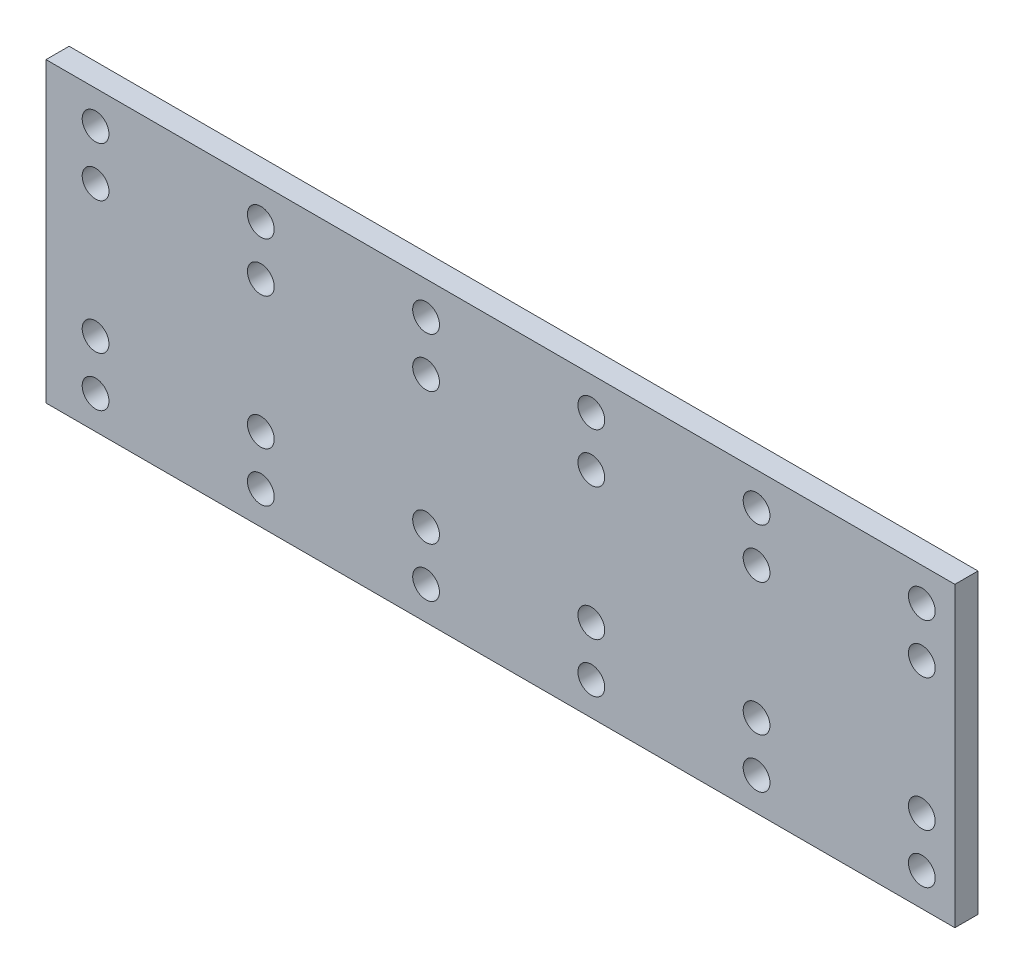
ISO-10303-21;
HEADER;
FILE_DESCRIPTION(('STEP AP214'),'2;1');
FILE_NAME('part.step','',(''),(''),'','','');
FILE_SCHEMA(('AUTOMOTIVE_DESIGN { 1 0 10303 214 1 1 1 1 }'));
ENDSEC;
DATA;
#1=APPLICATION_CONTEXT('core data for automotive mechanical design processes');
#2=APPLICATION_PROTOCOL_DEFINITION('international standard','automotive_design',2000,#1);
#3=PRODUCT_CONTEXT('',#1,'mechanical');
#4=PRODUCT('Part','Part','',(#3));
#5=PRODUCT_RELATED_PRODUCT_CATEGORY('part','',(#4));
#6=PRODUCT_DEFINITION_FORMATION('','',#4);
#7=PRODUCT_DEFINITION_CONTEXT('part definition',#1,'design');
#8=PRODUCT_DEFINITION('design','',#6,#7);
#9=PRODUCT_DEFINITION_SHAPE('','',#8);
#10=(LENGTH_UNIT() NAMED_UNIT(*) SI_UNIT(.MILLI.,.METRE.));
#11=(NAMED_UNIT(*) PLANE_ANGLE_UNIT() SI_UNIT($,.RADIAN.));
#12=(NAMED_UNIT(*) SI_UNIT($,.STERADIAN.) SOLID_ANGLE_UNIT());
#13=UNCERTAINTY_MEASURE_WITH_UNIT(LENGTH_MEASURE(1.E-05),#10,'distance_accuracy_value','');
#14=(GEOMETRIC_REPRESENTATION_CONTEXT(3) GLOBAL_UNCERTAINTY_ASSIGNED_CONTEXT((#13)) GLOBAL_UNIT_ASSIGNED_CONTEXT((#10,
#11,#12)) REPRESENTATION_CONTEXT('',''));
#15=CARTESIAN_POINT('',(0.,0.,0.));
#16=DIRECTION('',(0.,0.,1.));
#17=DIRECTION('',(1.,0.,0.));
#18=AXIS2_PLACEMENT_3D('',#15,#16,#17);
#19=CARTESIAN_POINT('',(0.,0.,7.));
#20=DIRECTION('',(1.,0.,0.));
#21=DIRECTION('',(0.,0.,-1.));
#22=AXIS2_PLACEMENT_3D('',#19,#20,#21);
#23=PLANE('',#22);
#24=DIRECTION('',(0.,-1.,0.));
#25=VECTOR('',#24,1.);
#26=CARTESIAN_POINT('',(0.,0.,0.));
#27=LINE('',#26,#25);
#28=CARTESIAN_POINT('',(0.,90.,0.));
#29=VERTEX_POINT('',#28);
#30=CARTESIAN_POINT('',(0.,0.,0.));
#31=VERTEX_POINT('',#30);
#32=EDGE_CURVE('E112',#29,#31,#27,.T.);
#33=ORIENTED_EDGE('',*,*,#32,.T.);
#34=DIRECTION('',(0.,0.,-1.));
#35=VECTOR('',#34,1.);
#36=CARTESIAN_POINT('',(0.,0.,7.));
#37=LINE('',#36,#35);
#38=CARTESIAN_POINT('',(0.,0.,7.));
#39=VERTEX_POINT('',#38);
#40=EDGE_CURVE('E13',#39,#31,#37,.T.);
#41=ORIENTED_EDGE('',*,*,#40,.F.);
#42=DIRECTION('',(0.,-1.,0.));
#43=VECTOR('',#42,1.);
#44=CARTESIAN_POINT('',(0.,0.,7.));
#45=LINE('',#44,#43);
#46=CARTESIAN_POINT('',(0.,90.,7.));
#47=VERTEX_POINT('',#46);
#48=EDGE_CURVE('E99',#47,#39,#45,.T.);
#49=ORIENTED_EDGE('',*,*,#48,.F.);
#50=DIRECTION('',(0.,0.,-1.));
#51=VECTOR('',#50,1.);
#52=CARTESIAN_POINT('',(0.,90.,7.));
#53=LINE('',#52,#51);
#54=EDGE_CURVE('E108',#47,#29,#53,.T.);
#55=ORIENTED_EDGE('',*,*,#54,.T.);
#56=EDGE_LOOP('',(#33,#41,#49,#55));
#57=FACE_BOUND('',#56,.T.);
#58=ADVANCED_FACE('F46',(#57),#23,.F.);
#59=CARTESIAN_POINT('',(0.,0.,7.));
#60=DIRECTION('',(0.,1.,0.));
#61=DIRECTION('',(0.,0.,1.));
#62=AXIS2_PLACEMENT_3D('',#59,#60,#61);
#63=PLANE('',#62);
#64=DIRECTION('',(1.,0.,0.));
#65=VECTOR('',#64,1.);
#66=CARTESIAN_POINT('',(0.,0.,0.));
#67=LINE('',#66,#65);
#68=CARTESIAN_POINT('',(275.,0.,0.));
#69=VERTEX_POINT('',#68);
#70=EDGE_CURVE('E103',#31,#69,#67,.T.);
#71=ORIENTED_EDGE('',*,*,#70,.T.);
#72=DIRECTION('',(0.,0.,-1.));
#73=VECTOR('',#72,1.);
#74=CARTESIAN_POINT('',(275.,0.,7.));
#75=LINE('',#74,#73);
#76=CARTESIAN_POINT('',(275.,0.,7.));
#77=VERTEX_POINT('',#76);
#78=EDGE_CURVE('E55',#77,#69,#75,.T.);
#79=ORIENTED_EDGE('',*,*,#78,.F.);
#80=DIRECTION('',(1.,0.,0.));
#81=VECTOR('',#80,1.);
#82=CARTESIAN_POINT('',(0.,0.,7.));
#83=LINE('',#82,#81);
#84=EDGE_CURVE('E94',#39,#77,#83,.T.);
#85=ORIENTED_EDGE('',*,*,#84,.F.);
#86=ORIENTED_EDGE('',*,*,#40,.T.);
#87=EDGE_LOOP('',(#71,#79,#85,#86));
#88=FACE_BOUND('',#87,.T.);
#89=ADVANCED_FACE('F102',(#88),#63,.F.);
#90=CARTESIAN_POINT('',(275.,0.,7.));
#91=DIRECTION('',(-1.,0.,0.));
#92=DIRECTION('',(0.,0.,1.));
#93=AXIS2_PLACEMENT_3D('',#90,#91,#92);
#94=PLANE('',#93);
#95=DIRECTION('',(0.,1.,0.));
#96=VECTOR('',#95,1.);
#97=CARTESIAN_POINT('',(275.,0.,0.));
#98=LINE('',#97,#96);
#99=CARTESIAN_POINT('',(275.,90.,0.));
#100=VERTEX_POINT('',#99);
#101=EDGE_CURVE('E81',#69,#100,#98,.T.);
#102=ORIENTED_EDGE('',*,*,#101,.T.);
#103=DIRECTION('',(0.,0.,-1.));
#104=VECTOR('',#103,1.);
#105=CARTESIAN_POINT('',(275.,90.,7.));
#106=LINE('',#105,#104);
#107=CARTESIAN_POINT('',(275.,90.,7.));
#108=VERTEX_POINT('',#107);
#109=EDGE_CURVE('E104',#108,#100,#106,.T.);
#110=ORIENTED_EDGE('',*,*,#109,.F.);
#111=DIRECTION('',(0.,1.,0.));
#112=VECTOR('',#111,1.);
#113=CARTESIAN_POINT('',(275.,0.,7.));
#114=LINE('',#113,#112);
#115=EDGE_CURVE('E97',#77,#108,#114,.T.);
#116=ORIENTED_EDGE('',*,*,#115,.F.);
#117=ORIENTED_EDGE('',*,*,#78,.T.);
#118=EDGE_LOOP('',(#102,#110,#116,#117));
#119=FACE_BOUND('',#118,.T.);
#120=ADVANCED_FACE('F106',(#119),#94,.F.);
#121=CARTESIAN_POINT('',(0.,90.,7.));
#122=DIRECTION('',(0.,-1.,0.));
#123=DIRECTION('',(0.,0.,-1.));
#124=AXIS2_PLACEMENT_3D('',#121,#122,#123);
#125=PLANE('',#124);
#126=DIRECTION('',(-1.,0.,0.));
#127=VECTOR('',#126,1.);
#128=CARTESIAN_POINT('',(0.,90.,0.));
#129=LINE('',#128,#127);
#130=EDGE_CURVE('E87',#100,#29,#129,.T.);
#131=ORIENTED_EDGE('',*,*,#130,.T.);
#132=ORIENTED_EDGE('',*,*,#54,.F.);
#133=DIRECTION('',(-1.,0.,0.));
#134=VECTOR('',#133,1.);
#135=CARTESIAN_POINT('',(0.,90.,7.));
#136=LINE('',#135,#134);
#137=EDGE_CURVE('E64',#108,#47,#136,.T.);
#138=ORIENTED_EDGE('',*,*,#137,.F.);
#139=ORIENTED_EDGE('',*,*,#109,.T.);
#140=EDGE_LOOP('',(#131,#132,#138,#139));
#141=FACE_BOUND('',#140,.T.);
#142=ADVANCED_FACE('F273',(#141),#125,.F.);
#143=CARTESIAN_POINT('',(0.,0.,7.));
#144=DIRECTION('',(0.,0.,-1.));
#145=DIRECTION('',(-1.,0.,0.));
#146=AXIS2_PLACEMENT_3D('',#143,#144,#145);
#147=PLANE('',#146);
#148=CARTESIAN_POINT('',(165.,9.99999999999928,7.));
#149=DIRECTION('',(0.,0.,1.));
#150=DIRECTION('',(1.,0.,0.));
#151=AXIS2_PLACEMENT_3D('',#148,#149,#150);
#152=CIRCLE('',#151,4.04999999999999);
#153=CARTESIAN_POINT('',(169.05,9.99999999999928,7.));
#154=VERTEX_POINT('',#153);
#155=EDGE_CURVE('E246',#154,#154,#152,.T.);
#156=ORIENTED_EDGE('',*,*,#155,.F.);
#157=EDGE_LOOP('',(#156));
#158=FACE_BOUND('',#157,.T.);
#159=CARTESIAN_POINT('',(165.,24.9999999999993,7.));
#160=DIRECTION('',(0.,0.,1.));
#161=DIRECTION('',(1.,0.,0.));
#162=AXIS2_PLACEMENT_3D('',#159,#160,#161);
#163=CIRCLE('',#162,4.04999999999999);
#164=CARTESIAN_POINT('',(169.05,24.9999999999993,7.));
#165=VERTEX_POINT('',#164);
#166=EDGE_CURVE('E262',#165,#165,#163,.T.);
#167=ORIENTED_EDGE('',*,*,#166,.F.);
#168=EDGE_LOOP('',(#167));
#169=FACE_BOUND('',#168,.T.);
#170=CARTESIAN_POINT('',(215.,24.9999999999996,7.));
#171=DIRECTION('',(0.,0.,1.));
#172=DIRECTION('',(1.,0.,0.));
#173=AXIS2_PLACEMENT_3D('',#170,#171,#172);
#174=CIRCLE('',#173,4.04999999999996);
#175=CARTESIAN_POINT('',(219.05,24.9999999999996,7.));
#176=VERTEX_POINT('',#175);
#177=EDGE_CURVE('E257',#176,#176,#174,.T.);
#178=ORIENTED_EDGE('',*,*,#177,.F.);
#179=EDGE_LOOP('',(#178));
#180=FACE_BOUND('',#179,.T.);
#181=CARTESIAN_POINT('',(215.,9.99999999999963,7.));
#182=DIRECTION('',(0.,0.,1.));
#183=DIRECTION('',(1.,0.,0.));
#184=AXIS2_PLACEMENT_3D('',#181,#182,#183);
#185=CIRCLE('',#184,4.04999999999996);
#186=CARTESIAN_POINT('',(219.05,9.99999999999963,7.));
#187=VERTEX_POINT('',#186);
#188=EDGE_CURVE('E254',#187,#187,#185,.T.);
#189=ORIENTED_EDGE('',*,*,#188,.F.);
#190=EDGE_LOOP('',(#189));
#191=FACE_BOUND('',#190,.T.);
#192=CARTESIAN_POINT('',(265.,25.,7.));
#193=DIRECTION('',(0.,0.,1.));
#194=DIRECTION('',(1.,0.,0.));
#195=AXIS2_PLACEMENT_3D('',#192,#193,#194);
#196=CIRCLE('',#195,4.05000000000002);
#197=CARTESIAN_POINT('',(269.05,25.,7.));
#198=VERTEX_POINT('',#197);
#199=EDGE_CURVE('E128',#198,#198,#196,.T.);
#200=ORIENTED_EDGE('',*,*,#199,.F.);
#201=EDGE_LOOP('',(#200));
#202=FACE_BOUND('',#201,.T.);
#203=CARTESIAN_POINT('',(265.,80.,7.));
#204=DIRECTION('',(0.,0.,1.));
#205=DIRECTION('',(1.,0.,0.));
#206=AXIS2_PLACEMENT_3D('',#203,#204,#205);
#207=CIRCLE('',#206,4.05000000000002);
#208=CARTESIAN_POINT('',(269.05,80.,7.));
#209=VERTEX_POINT('',#208);
#210=EDGE_CURVE('E202',#209,#209,#207,.T.);
#211=ORIENTED_EDGE('',*,*,#210,.F.);
#212=EDGE_LOOP('',(#211));
#213=FACE_BOUND('',#212,.T.);
#214=CARTESIAN_POINT('',(265.,65.,7.));
#215=DIRECTION('',(0.,0.,1.));
#216=DIRECTION('',(1.,0.,0.));
#217=AXIS2_PLACEMENT_3D('',#214,#215,#216);
#218=CIRCLE('',#217,4.05000000000002);
#219=CARTESIAN_POINT('',(269.05,65.,7.));
#220=VERTEX_POINT('',#219);
#221=EDGE_CURVE('E249',#220,#220,#218,.T.);
#222=ORIENTED_EDGE('',*,*,#221,.F.);
#223=EDGE_LOOP('',(#222));
#224=FACE_BOUND('',#223,.T.);
#225=CARTESIAN_POINT('',(215.,64.9999999999996,7.));
#226=DIRECTION('',(0.,0.,1.));
#227=DIRECTION('',(1.,0.,0.));
#228=AXIS2_PLACEMENT_3D('',#225,#226,#227);
#229=CIRCLE('',#228,4.04999999999996);
#230=CARTESIAN_POINT('',(219.05,64.9999999999996,7.));
#231=VERTEX_POINT('',#230);
#232=EDGE_CURVE('E240',#231,#231,#229,.T.);
#233=ORIENTED_EDGE('',*,*,#232,.F.);
#234=EDGE_LOOP('',(#233));
#235=FACE_BOUND('',#234,.T.);
#236=CARTESIAN_POINT('',(215.,79.9999999999996,7.));
#237=DIRECTION('',(0.,0.,1.));
#238=DIRECTION('',(1.,0.,0.));
#239=AXIS2_PLACEMENT_3D('',#236,#237,#238);
#240=CIRCLE('',#239,4.04999999999996);
#241=CARTESIAN_POINT('',(219.05,79.9999999999996,7.));
#242=VERTEX_POINT('',#241);
#243=EDGE_CURVE('E236',#242,#242,#240,.T.);
#244=ORIENTED_EDGE('',*,*,#243,.F.);
#245=EDGE_LOOP('',(#244));
#246=FACE_BOUND('',#245,.T.);
#247=CARTESIAN_POINT('',(165.,79.9999999999993,7.));
#248=DIRECTION('',(0.,0.,1.));
#249=DIRECTION('',(1.,0.,0.));
#250=AXIS2_PLACEMENT_3D('',#247,#248,#249);
#251=CIRCLE('',#250,4.04999999999999);
#252=CARTESIAN_POINT('',(169.05,79.9999999999993,7.));
#253=VERTEX_POINT('',#252);
#254=EDGE_CURVE('E239',#253,#253,#251,.T.);
#255=ORIENTED_EDGE('',*,*,#254,.F.);
#256=EDGE_LOOP('',(#255));
#257=FACE_BOUND('',#256,.T.);
#258=CARTESIAN_POINT('',(165.,64.9999999999993,7.));
#259=DIRECTION('',(0.,0.,1.));
#260=DIRECTION('',(1.,0.,0.));
#261=AXIS2_PLACEMENT_3D('',#258,#259,#260);
#262=CIRCLE('',#261,4.04999999999999);
#263=CARTESIAN_POINT('',(169.05,64.9999999999993,7.));
#264=VERTEX_POINT('',#263);
#265=EDGE_CURVE('E243',#264,#264,#262,.T.);
#266=ORIENTED_EDGE('',*,*,#265,.F.);
#267=EDGE_LOOP('',(#266));
#268=FACE_BOUND('',#267,.T.);
#269=CARTESIAN_POINT('',(65.0000000000001,9.99999999999858,7.));
#270=DIRECTION('',(0.,0.,1.));
#271=DIRECTION('',(1.,0.,0.));
#272=AXIS2_PLACEMENT_3D('',#269,#270,#271);
#273=CIRCLE('',#272,4.05);
#274=CARTESIAN_POINT('',(69.0500000000001,9.99999999999858,7.));
#275=VERTEX_POINT('',#274);
#276=EDGE_CURVE('E214',#275,#275,#273,.T.);
#277=ORIENTED_EDGE('',*,*,#276,.F.);
#278=EDGE_LOOP('',(#277));
#279=FACE_BOUND('',#278,.T.);
#280=CARTESIAN_POINT('',(65.0000000000001,24.9999999999986,7.));
#281=DIRECTION('',(0.,0.,1.));
#282=DIRECTION('',(1.,0.,0.));
#283=AXIS2_PLACEMENT_3D('',#280,#281,#282);
#284=CIRCLE('',#283,4.05);
#285=CARTESIAN_POINT('',(69.0500000000001,24.9999999999986,7.));
#286=VERTEX_POINT('',#285);
#287=EDGE_CURVE('E222',#286,#286,#284,.T.);
#288=ORIENTED_EDGE('',*,*,#287,.F.);
#289=EDGE_LOOP('',(#288));
#290=FACE_BOUND('',#289,.T.);
#291=CARTESIAN_POINT('',(15.0000000000001,79.9999999999982,7.));
#292=DIRECTION('',(0.,0.,1.));
#293=DIRECTION('',(1.,0.,0.));
#294=AXIS2_PLACEMENT_3D('',#291,#292,#293);
#295=CIRCLE('',#294,4.05);
#296=CARTESIAN_POINT('',(19.0500000000001,79.9999999999982,7.));
#297=VERTEX_POINT('',#296);
#298=EDGE_CURVE('E219',#297,#297,#295,.T.);
#299=ORIENTED_EDGE('',*,*,#298,.F.);
#300=EDGE_LOOP('',(#299));
#301=FACE_BOUND('',#300,.T.);
#302=CARTESIAN_POINT('',(15.0000000000001,64.9999999999982,7.));
#303=DIRECTION('',(0.,0.,1.));
#304=DIRECTION('',(1.,0.,0.));
#305=AXIS2_PLACEMENT_3D('',#302,#303,#304);
#306=CIRCLE('',#305,4.05);
#307=CARTESIAN_POINT('',(19.0500000000001,64.9999999999982,7.));
#308=VERTEX_POINT('',#307);
#309=EDGE_CURVE('E223',#308,#308,#306,.T.);
#310=ORIENTED_EDGE('',*,*,#309,.F.);
#311=EDGE_LOOP('',(#310));
#312=FACE_BOUND('',#311,.T.);
#313=CARTESIAN_POINT('',(15.0000000000001,24.9999999999982,7.));
#314=DIRECTION('',(0.,0.,1.));
#315=DIRECTION('',(1.,0.,0.));
#316=AXIS2_PLACEMENT_3D('',#313,#314,#315);
#317=CIRCLE('',#316,4.05);
#318=CARTESIAN_POINT('',(19.0500000000001,24.9999999999982,7.));
#319=VERTEX_POINT('',#318);
#320=EDGE_CURVE('E231',#319,#319,#317,.T.);
#321=ORIENTED_EDGE('',*,*,#320,.F.);
#322=EDGE_LOOP('',(#321));
#323=FACE_BOUND('',#322,.T.);
#324=CARTESIAN_POINT('',(15.0000000000001,9.99999999999824,7.));
#325=DIRECTION('',(0.,0.,1.));
#326=DIRECTION('',(1.,0.,0.));
#327=AXIS2_PLACEMENT_3D('',#324,#325,#326);
#328=CIRCLE('',#327,4.05);
#329=CARTESIAN_POINT('',(19.0500000000001,9.99999999999824,7.));
#330=VERTEX_POINT('',#329);
#331=EDGE_CURVE('E228',#330,#330,#328,.T.);
#332=ORIENTED_EDGE('',*,*,#331,.F.);
#333=EDGE_LOOP('',(#332));
#334=FACE_BOUND('',#333,.T.);
#335=CARTESIAN_POINT('',(115.,24.9999999999989,7.));
#336=DIRECTION('',(0.,0.,1.));
#337=DIRECTION('',(1.,0.,0.));
#338=AXIS2_PLACEMENT_3D('',#335,#336,#337);
#339=CIRCLE('',#338,4.04999999999999);
#340=CARTESIAN_POINT('',(119.05,24.9999999999989,7.));
#341=VERTEX_POINT('',#340);
#342=EDGE_CURVE('E204',#341,#341,#339,.T.);
#343=ORIENTED_EDGE('',*,*,#342,.F.);
#344=EDGE_LOOP('',(#343));
#345=FACE_BOUND('',#344,.T.);
#346=CARTESIAN_POINT('',(115.,79.9999999999989,7.));
#347=DIRECTION('',(0.,0.,1.));
#348=DIRECTION('',(1.,0.,0.));
#349=AXIS2_PLACEMENT_3D('',#346,#347,#348);
#350=CIRCLE('',#349,4.04999999999999);
#351=CARTESIAN_POINT('',(119.05,79.9999999999989,7.));
#352=VERTEX_POINT('',#351);
#353=EDGE_CURVE('E203',#352,#352,#350,.T.);
#354=ORIENTED_EDGE('',*,*,#353,.F.);
#355=EDGE_LOOP('',(#354));
#356=FACE_BOUND('',#355,.T.);
#357=CARTESIAN_POINT('',(115.,64.9999999999989,7.));
#358=DIRECTION('',(0.,0.,1.));
#359=DIRECTION('',(1.,0.,0.));
#360=AXIS2_PLACEMENT_3D('',#357,#358,#359);
#361=CIRCLE('',#360,4.04999999999999);
#362=CARTESIAN_POINT('',(119.05,64.9999999999989,7.));
#363=VERTEX_POINT('',#362);
#364=EDGE_CURVE('E199',#363,#363,#361,.T.);
#365=ORIENTED_EDGE('',*,*,#364,.F.);
#366=EDGE_LOOP('',(#365));
#367=FACE_BOUND('',#366,.T.);
#368=CARTESIAN_POINT('',(115.,9.99999999999893,7.));
#369=DIRECTION('',(0.,0.,1.));
#370=DIRECTION('',(1.,0.,0.));
#371=AXIS2_PLACEMENT_3D('',#368,#369,#370);
#372=CIRCLE('',#371,4.04999999999999);
#373=CARTESIAN_POINT('',(119.05,9.99999999999893,7.));
#374=VERTEX_POINT('',#373);
#375=EDGE_CURVE('E207',#374,#374,#372,.T.);
#376=ORIENTED_EDGE('',*,*,#375,.F.);
#377=EDGE_LOOP('',(#376));
#378=FACE_BOUND('',#377,.T.);
#379=CARTESIAN_POINT('',(65.0000000000001,64.9999999999986,7.));
#380=DIRECTION('',(0.,0.,1.));
#381=DIRECTION('',(1.,0.,0.));
#382=AXIS2_PLACEMENT_3D('',#379,#380,#381);
#383=CIRCLE('',#382,4.05);
#384=CARTESIAN_POINT('',(69.0500000000001,64.9999999999986,7.));
#385=VERTEX_POINT('',#384);
#386=EDGE_CURVE('E213',#385,#385,#383,.T.);
#387=ORIENTED_EDGE('',*,*,#386,.F.);
#388=EDGE_LOOP('',(#387));
#389=FACE_BOUND('',#388,.T.);
#390=CARTESIAN_POINT('',(65.0000000000001,79.9999999999986,7.));
#391=DIRECTION('',(0.,0.,1.));
#392=DIRECTION('',(1.,0.,0.));
#393=AXIS2_PLACEMENT_3D('',#390,#391,#392);
#394=CIRCLE('',#393,4.05);
#395=CARTESIAN_POINT('',(69.0500000000001,79.9999999999986,7.));
#396=VERTEX_POINT('',#395);
#397=EDGE_CURVE('E210',#396,#396,#394,.T.);
#398=ORIENTED_EDGE('',*,*,#397,.F.);
#399=EDGE_LOOP('',(#398));
#400=FACE_BOUND('',#399,.T.);
#401=CARTESIAN_POINT('',(265.,9.99999999999998,7.));
#402=DIRECTION('',(0.,0.,1.));
#403=DIRECTION('',(1.,0.,0.));
#404=AXIS2_PLACEMENT_3D('',#401,#402,#403);
#405=CIRCLE('',#404,4.05000000000002);
#406=CARTESIAN_POINT('',(269.05,9.99999999999998,7.));
#407=VERTEX_POINT('',#406);
#408=EDGE_CURVE('E123',#407,#407,#405,.T.);
#409=ORIENTED_EDGE('',*,*,#408,.F.);
#410=EDGE_LOOP('',(#409));
#411=FACE_BOUND('',#410,.T.);
#412=ORIENTED_EDGE('',*,*,#48,.T.);
#413=ORIENTED_EDGE('',*,*,#84,.T.);
#414=ORIENTED_EDGE('',*,*,#115,.T.);
#415=ORIENTED_EDGE('',*,*,#137,.T.);
#416=EDGE_LOOP('',(#412,#413,#414,#415));
#417=FACE_BOUND('',#416,.T.);
#418=ADVANCED_FACE('F95',(#158,#169,#180,#191,#202,#213,#224,#235,#246,#257,#268,#279,#290,#301,
#312,#323,#334,#345,#356,#367,#378,#389,#400,#411,#417),#147,.F.);
#419=CARTESIAN_POINT('',(0.,0.,0.));
#420=DIRECTION('',(0.,0.,-1.));
#421=DIRECTION('',(-1.,0.,0.));
#422=AXIS2_PLACEMENT_3D('',#419,#420,#421);
#423=PLANE('',#422);
#424=CARTESIAN_POINT('',(165.,9.99999999999928,0.));
#425=DIRECTION('',(0.,0.,-1.));
#426=DIRECTION('',(-1.,0.,0.));
#427=AXIS2_PLACEMENT_3D('',#424,#425,#426);
#428=CIRCLE('',#427,4.04999999999999);
#429=CARTESIAN_POINT('',(160.95,9.99999999999928,0.));
#430=VERTEX_POINT('',#429);
#431=EDGE_CURVE('E49',#430,#430,#428,.T.);
#432=ORIENTED_EDGE('',*,*,#431,.F.);
#433=EDGE_LOOP('',(#432));
#434=FACE_BOUND('',#433,.T.);
#435=CARTESIAN_POINT('',(165.,24.9999999999993,0.));
#436=DIRECTION('',(0.,0.,-1.));
#437=DIRECTION('',(-1.,0.,0.));
#438=AXIS2_PLACEMENT_3D('',#435,#436,#437);
#439=CIRCLE('',#438,4.04999999999999);
#440=CARTESIAN_POINT('',(160.95,24.9999999999993,0.));
#441=VERTEX_POINT('',#440);
#442=EDGE_CURVE('E187',#441,#441,#439,.T.);
#443=ORIENTED_EDGE('',*,*,#442,.F.);
#444=EDGE_LOOP('',(#443));
#445=FACE_BOUND('',#444,.T.);
#446=CARTESIAN_POINT('',(215.,24.9999999999996,0.));
#447=DIRECTION('',(0.,0.,-1.));
#448=DIRECTION('',(-1.,0.,0.));
#449=AXIS2_PLACEMENT_3D('',#446,#447,#448);
#450=CIRCLE('',#449,4.04999999999996);
#451=CARTESIAN_POINT('',(210.95,24.9999999999996,0.));
#452=VERTEX_POINT('',#451);
#453=EDGE_CURVE('E185',#452,#452,#450,.T.);
#454=ORIENTED_EDGE('',*,*,#453,.F.);
#455=EDGE_LOOP('',(#454));
#456=FACE_BOUND('',#455,.T.);
#457=CARTESIAN_POINT('',(215.,9.99999999999963,0.));
#458=DIRECTION('',(0.,0.,-1.));
#459=DIRECTION('',(-1.,0.,0.));
#460=AXIS2_PLACEMENT_3D('',#457,#458,#459);
#461=CIRCLE('',#460,4.04999999999996);
#462=CARTESIAN_POINT('',(210.95,9.99999999999963,0.));
#463=VERTEX_POINT('',#462);
#464=EDGE_CURVE('E182',#463,#463,#461,.T.);
#465=ORIENTED_EDGE('',*,*,#464,.F.);
#466=EDGE_LOOP('',(#465));
#467=FACE_BOUND('',#466,.T.);
#468=CARTESIAN_POINT('',(265.,25.,0.));
#469=DIRECTION('',(0.,0.,-1.));
#470=DIRECTION('',(-1.,0.,0.));
#471=AXIS2_PLACEMENT_3D('',#468,#469,#470);
#472=CIRCLE('',#471,4.05000000000002);
#473=CARTESIAN_POINT('',(260.95,25.,0.));
#474=VERTEX_POINT('',#473);
#475=EDGE_CURVE('E179',#474,#474,#472,.T.);
#476=ORIENTED_EDGE('',*,*,#475,.F.);
#477=EDGE_LOOP('',(#476));
#478=FACE_BOUND('',#477,.T.);
#479=CARTESIAN_POINT('',(265.,80.,0.));
#480=DIRECTION('',(0.,0.,-1.));
#481=DIRECTION('',(-1.,0.,0.));
#482=AXIS2_PLACEMENT_3D('',#479,#480,#481);
#483=CIRCLE('',#482,4.05000000000002);
#484=CARTESIAN_POINT('',(260.95,80.,0.));
#485=VERTEX_POINT('',#484);
#486=EDGE_CURVE('E176',#485,#485,#483,.T.);
#487=ORIENTED_EDGE('',*,*,#486,.F.);
#488=EDGE_LOOP('',(#487));
#489=FACE_BOUND('',#488,.T.);
#490=CARTESIAN_POINT('',(265.,65.,0.));
#491=DIRECTION('',(0.,0.,-1.));
#492=DIRECTION('',(-1.,0.,0.));
#493=AXIS2_PLACEMENT_3D('',#490,#491,#492);
#494=CIRCLE('',#493,4.05000000000002);
#495=CARTESIAN_POINT('',(260.95,65.,0.));
#496=VERTEX_POINT('',#495);
#497=EDGE_CURVE('E173',#496,#496,#494,.T.);
#498=ORIENTED_EDGE('',*,*,#497,.F.);
#499=EDGE_LOOP('',(#498));
#500=FACE_BOUND('',#499,.T.);
#501=CARTESIAN_POINT('',(215.,64.9999999999996,0.));
#502=DIRECTION('',(0.,0.,-1.));
#503=DIRECTION('',(-1.,0.,0.));
#504=AXIS2_PLACEMENT_3D('',#501,#502,#503);
#505=CIRCLE('',#504,4.04999999999996);
#506=CARTESIAN_POINT('',(210.95,64.9999999999996,0.));
#507=VERTEX_POINT('',#506);
#508=EDGE_CURVE('E170',#507,#507,#505,.T.);
#509=ORIENTED_EDGE('',*,*,#508,.F.);
#510=EDGE_LOOP('',(#509));
#511=FACE_BOUND('',#510,.T.);
#512=CARTESIAN_POINT('',(215.,79.9999999999996,0.));
#513=DIRECTION('',(0.,0.,-1.));
#514=DIRECTION('',(-1.,0.,0.));
#515=AXIS2_PLACEMENT_3D('',#512,#513,#514);
#516=CIRCLE('',#515,4.04999999999996);
#517=CARTESIAN_POINT('',(210.95,79.9999999999996,0.));
#518=VERTEX_POINT('',#517);
#519=EDGE_CURVE('E167',#518,#518,#516,.T.);
#520=ORIENTED_EDGE('',*,*,#519,.F.);
#521=EDGE_LOOP('',(#520));
#522=FACE_BOUND('',#521,.T.);
#523=CARTESIAN_POINT('',(165.,79.9999999999993,0.));
#524=DIRECTION('',(0.,0.,-1.));
#525=DIRECTION('',(-1.,0.,0.));
#526=AXIS2_PLACEMENT_3D('',#523,#524,#525);
#527=CIRCLE('',#526,4.04999999999999);
#528=CARTESIAN_POINT('',(160.95,79.9999999999993,0.));
#529=VERTEX_POINT('',#528);
#530=EDGE_CURVE('E164',#529,#529,#527,.T.);
#531=ORIENTED_EDGE('',*,*,#530,.F.);
#532=EDGE_LOOP('',(#531));
#533=FACE_BOUND('',#532,.T.);
#534=CARTESIAN_POINT('',(165.,64.9999999999993,0.));
#535=DIRECTION('',(0.,0.,-1.));
#536=DIRECTION('',(-1.,0.,0.));
#537=AXIS2_PLACEMENT_3D('',#534,#535,#536);
#538=CIRCLE('',#537,4.04999999999999);
#539=CARTESIAN_POINT('',(160.95,64.9999999999993,0.));
#540=VERTEX_POINT('',#539);
#541=EDGE_CURVE('E161',#540,#540,#538,.T.);
#542=ORIENTED_EDGE('',*,*,#541,.F.);
#543=EDGE_LOOP('',(#542));
#544=FACE_BOUND('',#543,.T.);
#545=CARTESIAN_POINT('',(65.0000000000001,9.99999999999858,0.));
#546=DIRECTION('',(0.,0.,-1.));
#547=DIRECTION('',(-1.,0.,0.));
#548=AXIS2_PLACEMENT_3D('',#545,#546,#547);
#549=CIRCLE('',#548,4.05);
#550=CARTESIAN_POINT('',(60.9500000000001,9.99999999999858,0.));
#551=VERTEX_POINT('',#550);
#552=EDGE_CURVE('E158',#551,#551,#549,.T.);
#553=ORIENTED_EDGE('',*,*,#552,.F.);
#554=EDGE_LOOP('',(#553));
#555=FACE_BOUND('',#554,.T.);
#556=CARTESIAN_POINT('',(65.0000000000001,24.9999999999986,0.));
#557=DIRECTION('',(0.,0.,-1.));
#558=DIRECTION('',(-1.,0.,0.));
#559=AXIS2_PLACEMENT_3D('',#556,#557,#558);
#560=CIRCLE('',#559,4.05);
#561=CARTESIAN_POINT('',(60.9500000000001,24.9999999999986,0.));
#562=VERTEX_POINT('',#561);
#563=EDGE_CURVE('E155',#562,#562,#560,.T.);
#564=ORIENTED_EDGE('',*,*,#563,.F.);
#565=EDGE_LOOP('',(#564));
#566=FACE_BOUND('',#565,.T.);
#567=CARTESIAN_POINT('',(15.0000000000001,79.9999999999982,0.));
#568=DIRECTION('',(0.,0.,-1.));
#569=DIRECTION('',(-1.,0.,0.));
#570=AXIS2_PLACEMENT_3D('',#567,#568,#569);
#571=CIRCLE('',#570,4.05);
#572=CARTESIAN_POINT('',(10.9500000000001,79.9999999999982,0.));
#573=VERTEX_POINT('',#572);
#574=EDGE_CURVE('E152',#573,#573,#571,.T.);
#575=ORIENTED_EDGE('',*,*,#574,.F.);
#576=EDGE_LOOP('',(#575));
#577=FACE_BOUND('',#576,.T.);
#578=CARTESIAN_POINT('',(15.0000000000001,64.9999999999982,0.));
#579=DIRECTION('',(0.,0.,-1.));
#580=DIRECTION('',(-1.,0.,0.));
#581=AXIS2_PLACEMENT_3D('',#578,#579,#580);
#582=CIRCLE('',#581,4.05);
#583=CARTESIAN_POINT('',(10.9500000000001,64.9999999999982,0.));
#584=VERTEX_POINT('',#583);
#585=EDGE_CURVE('E149',#584,#584,#582,.T.);
#586=ORIENTED_EDGE('',*,*,#585,.F.);
#587=EDGE_LOOP('',(#586));
#588=FACE_BOUND('',#587,.T.);
#589=CARTESIAN_POINT('',(15.0000000000001,24.9999999999982,0.));
#590=DIRECTION('',(0.,0.,-1.));
#591=DIRECTION('',(-1.,0.,0.));
#592=AXIS2_PLACEMENT_3D('',#589,#590,#591);
#593=CIRCLE('',#592,4.05);
#594=CARTESIAN_POINT('',(10.9500000000001,24.9999999999982,0.));
#595=VERTEX_POINT('',#594);
#596=EDGE_CURVE('E146',#595,#595,#593,.T.);
#597=ORIENTED_EDGE('',*,*,#596,.F.);
#598=EDGE_LOOP('',(#597));
#599=FACE_BOUND('',#598,.T.);
#600=CARTESIAN_POINT('',(15.0000000000001,9.99999999999824,0.));
#601=DIRECTION('',(0.,0.,-1.));
#602=DIRECTION('',(-1.,0.,0.));
#603=AXIS2_PLACEMENT_3D('',#600,#601,#602);
#604=CIRCLE('',#603,4.05);
#605=CARTESIAN_POINT('',(10.9500000000001,9.99999999999824,0.));
#606=VERTEX_POINT('',#605);
#607=EDGE_CURVE('E143',#606,#606,#604,.T.);
#608=ORIENTED_EDGE('',*,*,#607,.F.);
#609=EDGE_LOOP('',(#608));
#610=FACE_BOUND('',#609,.T.);
#611=CARTESIAN_POINT('',(115.,24.9999999999989,0.));
#612=DIRECTION('',(0.,0.,-1.));
#613=DIRECTION('',(-1.,0.,0.));
#614=AXIS2_PLACEMENT_3D('',#611,#612,#613);
#615=CIRCLE('',#614,4.04999999999999);
#616=CARTESIAN_POINT('',(110.95,24.9999999999989,0.));
#617=VERTEX_POINT('',#616);
#618=EDGE_CURVE('E140',#617,#617,#615,.T.);
#619=ORIENTED_EDGE('',*,*,#618,.F.);
#620=EDGE_LOOP('',(#619));
#621=FACE_BOUND('',#620,.T.);
#622=CARTESIAN_POINT('',(115.,79.9999999999989,0.));
#623=DIRECTION('',(0.,0.,-1.));
#624=DIRECTION('',(-1.,0.,0.));
#625=AXIS2_PLACEMENT_3D('',#622,#623,#624);
#626=CIRCLE('',#625,4.04999999999999);
#627=CARTESIAN_POINT('',(110.95,79.9999999999989,0.));
#628=VERTEX_POINT('',#627);
#629=EDGE_CURVE('E137',#628,#628,#626,.T.);
#630=ORIENTED_EDGE('',*,*,#629,.F.);
#631=EDGE_LOOP('',(#630));
#632=FACE_BOUND('',#631,.T.);
#633=CARTESIAN_POINT('',(115.,64.9999999999989,0.));
#634=DIRECTION('',(0.,0.,-1.));
#635=DIRECTION('',(-1.,0.,0.));
#636=AXIS2_PLACEMENT_3D('',#633,#634,#635);
#637=CIRCLE('',#636,4.04999999999999);
#638=CARTESIAN_POINT('',(110.95,64.9999999999989,0.));
#639=VERTEX_POINT('',#638);
#640=EDGE_CURVE('E134',#639,#639,#637,.T.);
#641=ORIENTED_EDGE('',*,*,#640,.F.);
#642=EDGE_LOOP('',(#641));
#643=FACE_BOUND('',#642,.T.);
#644=CARTESIAN_POINT('',(115.,9.99999999999893,0.));
#645=DIRECTION('',(0.,0.,-1.));
#646=DIRECTION('',(-1.,0.,0.));
#647=AXIS2_PLACEMENT_3D('',#644,#645,#646);
#648=CIRCLE('',#647,4.04999999999999);
#649=CARTESIAN_POINT('',(110.95,9.99999999999893,0.));
#650=VERTEX_POINT('',#649);
#651=EDGE_CURVE('E131',#650,#650,#648,.T.);
#652=ORIENTED_EDGE('',*,*,#651,.F.);
#653=EDGE_LOOP('',(#652));
#654=FACE_BOUND('',#653,.T.);
#655=CARTESIAN_POINT('',(65.0000000000001,64.9999999999986,0.));
#656=DIRECTION('',(0.,0.,-1.));
#657=DIRECTION('',(-1.,0.,0.));
#658=AXIS2_PLACEMENT_3D('',#655,#656,#657);
#659=CIRCLE('',#658,4.05);
#660=CARTESIAN_POINT('',(60.9500000000001,64.9999999999986,0.));
#661=VERTEX_POINT('',#660);
#662=EDGE_CURVE('E127',#661,#661,#659,.T.);
#663=ORIENTED_EDGE('',*,*,#662,.F.);
#664=EDGE_LOOP('',(#663));
#665=FACE_BOUND('',#664,.T.);
#666=CARTESIAN_POINT('',(65.0000000000001,79.9999999999986,0.));
#667=DIRECTION('',(0.,0.,-1.));
#668=DIRECTION('',(-1.,0.,0.));
#669=AXIS2_PLACEMENT_3D('',#666,#667,#668);
#670=CIRCLE('',#669,4.05);
#671=CARTESIAN_POINT('',(60.9500000000001,79.9999999999986,0.));
#672=VERTEX_POINT('',#671);
#673=EDGE_CURVE('E124',#672,#672,#670,.T.);
#674=ORIENTED_EDGE('',*,*,#673,.F.);
#675=EDGE_LOOP('',(#674));
#676=FACE_BOUND('',#675,.T.);
#677=CARTESIAN_POINT('',(265.,9.99999999999998,0.));
#678=DIRECTION('',(0.,0.,-1.));
#679=DIRECTION('',(-1.,0.,0.));
#680=AXIS2_PLACEMENT_3D('',#677,#678,#679);
#681=CIRCLE('',#680,4.05000000000002);
#682=CARTESIAN_POINT('',(260.95,9.99999999999998,0.));
#683=VERTEX_POINT('',#682);
#684=EDGE_CURVE('E115',#683,#683,#681,.T.);
#685=ORIENTED_EDGE('',*,*,#684,.F.);
#686=EDGE_LOOP('',(#685));
#687=FACE_BOUND('',#686,.T.);
#688=ORIENTED_EDGE('',*,*,#32,.F.);
#689=ORIENTED_EDGE('',*,*,#130,.F.);
#690=ORIENTED_EDGE('',*,*,#101,.F.);
#691=ORIENTED_EDGE('',*,*,#70,.F.);
#692=EDGE_LOOP('',(#688,#689,#690,#691));
#693=FACE_BOUND('',#692,.T.);
#694=ADVANCED_FACE('F272',(#434,#445,#456,#467,#478,#489,#500,#511,#522,#533,#544,#555,#566,
#577,#588,#599,#610,#621,#632,#643,#654,#665,#676,#687,#693),#423,.T.);
#695=CARTESIAN_POINT('',(265.,9.99999999999998,-3.));
#696=DIRECTION('',(0.,0.,1.));
#697=DIRECTION('',(1.,0.,0.));
#698=AXIS2_PLACEMENT_3D('',#695,#696,#697);
#699=CYLINDRICAL_SURFACE('',#698,4.05000000000002);
#700=ORIENTED_EDGE('',*,*,#684,.T.);
#701=EDGE_LOOP('',(#700));
#702=FACE_BOUND('',#701,.T.);
#703=ORIENTED_EDGE('',*,*,#408,.T.);
#704=EDGE_LOOP('',(#703));
#705=FACE_BOUND('',#704,.T.);
#706=ADVANCED_FACE('F320',(#702,#705),#699,.F.);
#707=CARTESIAN_POINT('',(65.0000000000001,79.9999999999986,-3.));
#708=DIRECTION('',(0.,0.,1.));
#709=DIRECTION('',(1.,0.,0.));
#710=AXIS2_PLACEMENT_3D('',#707,#708,#709);
#711=CYLINDRICAL_SURFACE('',#710,4.05);
#712=ORIENTED_EDGE('',*,*,#673,.T.);
#713=EDGE_LOOP('',(#712));
#714=FACE_BOUND('',#713,.T.);
#715=ORIENTED_EDGE('',*,*,#397,.T.);
#716=EDGE_LOOP('',(#715));
#717=FACE_BOUND('',#716,.T.);
#718=ADVANCED_FACE('F317',(#714,#717),#711,.F.);
#719=CARTESIAN_POINT('',(65.0000000000001,64.9999999999986,-3.));
#720=DIRECTION('',(0.,0.,1.));
#721=DIRECTION('',(1.,0.,0.));
#722=AXIS2_PLACEMENT_3D('',#719,#720,#721);
#723=CYLINDRICAL_SURFACE('',#722,4.05);
#724=ORIENTED_EDGE('',*,*,#662,.T.);
#725=EDGE_LOOP('',(#724));
#726=FACE_BOUND('',#725,.T.);
#727=ORIENTED_EDGE('',*,*,#386,.T.);
#728=EDGE_LOOP('',(#727));
#729=FACE_BOUND('',#728,.T.);
#730=ADVANCED_FACE('F319',(#726,#729),#723,.F.);
#731=CARTESIAN_POINT('',(115.,9.99999999999893,-3.));
#732=DIRECTION('',(0.,0.,1.));
#733=DIRECTION('',(1.,0.,0.));
#734=AXIS2_PLACEMENT_3D('',#731,#732,#733);
#735=CYLINDRICAL_SURFACE('',#734,4.04999999999999);
#736=ORIENTED_EDGE('',*,*,#651,.T.);
#737=EDGE_LOOP('',(#736));
#738=FACE_BOUND('',#737,.T.);
#739=ORIENTED_EDGE('',*,*,#375,.T.);
#740=EDGE_LOOP('',(#739));
#741=FACE_BOUND('',#740,.T.);
#742=ADVANCED_FACE('F327',(#738,#741),#735,.F.);
#743=CARTESIAN_POINT('',(115.,64.9999999999989,-3.));
#744=DIRECTION('',(0.,0.,1.));
#745=DIRECTION('',(1.,0.,0.));
#746=AXIS2_PLACEMENT_3D('',#743,#744,#745);
#747=CYLINDRICAL_SURFACE('',#746,4.04999999999999);
#748=ORIENTED_EDGE('',*,*,#640,.T.);
#749=EDGE_LOOP('',(#748));
#750=FACE_BOUND('',#749,.T.);
#751=ORIENTED_EDGE('',*,*,#364,.T.);
#752=EDGE_LOOP('',(#751));
#753=FACE_BOUND('',#752,.T.);
#754=ADVANCED_FACE('F391',(#750,#753),#747,.F.);
#755=CARTESIAN_POINT('',(115.,79.9999999999989,-3.));
#756=DIRECTION('',(0.,0.,1.));
#757=DIRECTION('',(1.,0.,0.));
#758=AXIS2_PLACEMENT_3D('',#755,#756,#757);
#759=CYLINDRICAL_SURFACE('',#758,4.04999999999999);
#760=ORIENTED_EDGE('',*,*,#629,.T.);
#761=EDGE_LOOP('',(#760));
#762=FACE_BOUND('',#761,.T.);
#763=ORIENTED_EDGE('',*,*,#353,.T.);
#764=EDGE_LOOP('',(#763));
#765=FACE_BOUND('',#764,.T.);
#766=ADVANCED_FACE('F401',(#762,#765),#759,.F.);
#767=CARTESIAN_POINT('',(115.,24.9999999999989,-3.));
#768=DIRECTION('',(0.,0.,1.));
#769=DIRECTION('',(1.,0.,0.));
#770=AXIS2_PLACEMENT_3D('',#767,#768,#769);
#771=CYLINDRICAL_SURFACE('',#770,4.04999999999999);
#772=ORIENTED_EDGE('',*,*,#618,.T.);
#773=EDGE_LOOP('',(#772));
#774=FACE_BOUND('',#773,.T.);
#775=ORIENTED_EDGE('',*,*,#342,.T.);
#776=EDGE_LOOP('',(#775));
#777=FACE_BOUND('',#776,.T.);
#778=ADVANCED_FACE('F411',(#774,#777),#771,.F.);
#779=CARTESIAN_POINT('',(15.0000000000001,9.99999999999824,-3.));
#780=DIRECTION('',(0.,0.,1.));
#781=DIRECTION('',(1.,0.,0.));
#782=AXIS2_PLACEMENT_3D('',#779,#780,#781);
#783=CYLINDRICAL_SURFACE('',#782,4.05);
#784=ORIENTED_EDGE('',*,*,#607,.T.);
#785=EDGE_LOOP('',(#784));
#786=FACE_BOUND('',#785,.T.);
#787=ORIENTED_EDGE('',*,*,#331,.T.);
#788=EDGE_LOOP('',(#787));
#789=FACE_BOUND('',#788,.T.);
#790=ADVANCED_FACE('F420',(#786,#789),#783,.F.);
#791=CARTESIAN_POINT('',(15.0000000000001,24.9999999999982,-3.));
#792=DIRECTION('',(0.,0.,1.));
#793=DIRECTION('',(1.,0.,0.));
#794=AXIS2_PLACEMENT_3D('',#791,#792,#793);
#795=CYLINDRICAL_SURFACE('',#794,4.05);
#796=ORIENTED_EDGE('',*,*,#596,.T.);
#797=EDGE_LOOP('',(#796));
#798=FACE_BOUND('',#797,.T.);
#799=ORIENTED_EDGE('',*,*,#320,.T.);
#800=EDGE_LOOP('',(#799));
#801=FACE_BOUND('',#800,.T.);
#802=ADVANCED_FACE('F430',(#798,#801),#795,.F.);
#803=CARTESIAN_POINT('',(15.0000000000001,64.9999999999982,-3.));
#804=DIRECTION('',(0.,0.,1.));
#805=DIRECTION('',(1.,0.,0.));
#806=AXIS2_PLACEMENT_3D('',#803,#804,#805);
#807=CYLINDRICAL_SURFACE('',#806,4.05);
#808=ORIENTED_EDGE('',*,*,#585,.T.);
#809=EDGE_LOOP('',(#808));
#810=FACE_BOUND('',#809,.T.);
#811=ORIENTED_EDGE('',*,*,#309,.T.);
#812=EDGE_LOOP('',(#811));
#813=FACE_BOUND('',#812,.T.);
#814=ADVANCED_FACE('F440',(#810,#813),#807,.F.);
#815=CARTESIAN_POINT('',(15.0000000000001,79.9999999999982,-3.));
#816=DIRECTION('',(0.,0.,1.));
#817=DIRECTION('',(1.,0.,0.));
#818=AXIS2_PLACEMENT_3D('',#815,#816,#817);
#819=CYLINDRICAL_SURFACE('',#818,4.05);
#820=ORIENTED_EDGE('',*,*,#574,.T.);
#821=EDGE_LOOP('',(#820));
#822=FACE_BOUND('',#821,.T.);
#823=ORIENTED_EDGE('',*,*,#298,.T.);
#824=EDGE_LOOP('',(#823));
#825=FACE_BOUND('',#824,.T.);
#826=ADVANCED_FACE('F450',(#822,#825),#819,.F.);
#827=CARTESIAN_POINT('',(65.0000000000001,24.9999999999986,-3.));
#828=DIRECTION('',(0.,0.,1.));
#829=DIRECTION('',(1.,0.,0.));
#830=AXIS2_PLACEMENT_3D('',#827,#828,#829);
#831=CYLINDRICAL_SURFACE('',#830,4.05);
#832=ORIENTED_EDGE('',*,*,#563,.T.);
#833=EDGE_LOOP('',(#832));
#834=FACE_BOUND('',#833,.T.);
#835=ORIENTED_EDGE('',*,*,#287,.T.);
#836=EDGE_LOOP('',(#835));
#837=FACE_BOUND('',#836,.T.);
#838=ADVANCED_FACE('F460',(#834,#837),#831,.F.);
#839=CARTESIAN_POINT('',(65.0000000000001,9.99999999999858,-3.));
#840=DIRECTION('',(0.,0.,1.));
#841=DIRECTION('',(1.,0.,0.));
#842=AXIS2_PLACEMENT_3D('',#839,#840,#841);
#843=CYLINDRICAL_SURFACE('',#842,4.05);
#844=ORIENTED_EDGE('',*,*,#552,.T.);
#845=EDGE_LOOP('',(#844));
#846=FACE_BOUND('',#845,.T.);
#847=ORIENTED_EDGE('',*,*,#276,.T.);
#848=EDGE_LOOP('',(#847));
#849=FACE_BOUND('',#848,.T.);
#850=ADVANCED_FACE('F470',(#846,#849),#843,.F.);
#851=CARTESIAN_POINT('',(165.,64.9999999999993,-3.));
#852=DIRECTION('',(0.,0.,1.));
#853=DIRECTION('',(1.,0.,0.));
#854=AXIS2_PLACEMENT_3D('',#851,#852,#853);
#855=CYLINDRICAL_SURFACE('',#854,4.04999999999999);
#856=ORIENTED_EDGE('',*,*,#541,.T.);
#857=EDGE_LOOP('',(#856));
#858=FACE_BOUND('',#857,.T.);
#859=ORIENTED_EDGE('',*,*,#265,.T.);
#860=EDGE_LOOP('',(#859));
#861=FACE_BOUND('',#860,.T.);
#862=ADVANCED_FACE('F480',(#858,#861),#855,.F.);
#863=CARTESIAN_POINT('',(165.,79.9999999999993,-3.));
#864=DIRECTION('',(0.,0.,1.));
#865=DIRECTION('',(1.,0.,0.));
#866=AXIS2_PLACEMENT_3D('',#863,#864,#865);
#867=CYLINDRICAL_SURFACE('',#866,4.04999999999999);
#868=ORIENTED_EDGE('',*,*,#530,.T.);
#869=EDGE_LOOP('',(#868));
#870=FACE_BOUND('',#869,.T.);
#871=ORIENTED_EDGE('',*,*,#254,.T.);
#872=EDGE_LOOP('',(#871));
#873=FACE_BOUND('',#872,.T.);
#874=ADVANCED_FACE('F490',(#870,#873),#867,.F.);
#875=CARTESIAN_POINT('',(215.,79.9999999999996,-3.));
#876=DIRECTION('',(0.,0.,1.));
#877=DIRECTION('',(1.,0.,0.));
#878=AXIS2_PLACEMENT_3D('',#875,#876,#877);
#879=CYLINDRICAL_SURFACE('',#878,4.04999999999996);
#880=ORIENTED_EDGE('',*,*,#519,.T.);
#881=EDGE_LOOP('',(#880));
#882=FACE_BOUND('',#881,.T.);
#883=ORIENTED_EDGE('',*,*,#243,.T.);
#884=EDGE_LOOP('',(#883));
#885=FACE_BOUND('',#884,.T.);
#886=ADVANCED_FACE('F500',(#882,#885),#879,.F.);
#887=CARTESIAN_POINT('',(215.,64.9999999999996,-3.));
#888=DIRECTION('',(0.,0.,1.));
#889=DIRECTION('',(1.,0.,0.));
#890=AXIS2_PLACEMENT_3D('',#887,#888,#889);
#891=CYLINDRICAL_SURFACE('',#890,4.04999999999996);
#892=ORIENTED_EDGE('',*,*,#508,.T.);
#893=EDGE_LOOP('',(#892));
#894=FACE_BOUND('',#893,.T.);
#895=ORIENTED_EDGE('',*,*,#232,.T.);
#896=EDGE_LOOP('',(#895));
#897=FACE_BOUND('',#896,.T.);
#898=ADVANCED_FACE('F510',(#894,#897),#891,.F.);
#899=CARTESIAN_POINT('',(265.,65.,-3.));
#900=DIRECTION('',(0.,0.,1.));
#901=DIRECTION('',(1.,0.,0.));
#902=AXIS2_PLACEMENT_3D('',#899,#900,#901);
#903=CYLINDRICAL_SURFACE('',#902,4.05000000000002);
#904=ORIENTED_EDGE('',*,*,#497,.T.);
#905=EDGE_LOOP('',(#904));
#906=FACE_BOUND('',#905,.T.);
#907=ORIENTED_EDGE('',*,*,#221,.T.);
#908=EDGE_LOOP('',(#907));
#909=FACE_BOUND('',#908,.T.);
#910=ADVANCED_FACE('F520',(#906,#909),#903,.F.);
#911=CARTESIAN_POINT('',(265.,80.,-3.));
#912=DIRECTION('',(0.,0.,1.));
#913=DIRECTION('',(1.,0.,0.));
#914=AXIS2_PLACEMENT_3D('',#911,#912,#913);
#915=CYLINDRICAL_SURFACE('',#914,4.05000000000002);
#916=ORIENTED_EDGE('',*,*,#486,.T.);
#917=EDGE_LOOP('',(#916));
#918=FACE_BOUND('',#917,.T.);
#919=ORIENTED_EDGE('',*,*,#210,.T.);
#920=EDGE_LOOP('',(#919));
#921=FACE_BOUND('',#920,.T.);
#922=ADVANCED_FACE('F530',(#918,#921),#915,.F.);
#923=CARTESIAN_POINT('',(265.,25.,-3.));
#924=DIRECTION('',(0.,0.,1.));
#925=DIRECTION('',(1.,0.,0.));
#926=AXIS2_PLACEMENT_3D('',#923,#924,#925);
#927=CYLINDRICAL_SURFACE('',#926,4.05000000000002);
#928=ORIENTED_EDGE('',*,*,#475,.T.);
#929=EDGE_LOOP('',(#928));
#930=FACE_BOUND('',#929,.T.);
#931=ORIENTED_EDGE('',*,*,#199,.T.);
#932=EDGE_LOOP('',(#931));
#933=FACE_BOUND('',#932,.T.);
#934=ADVANCED_FACE('F540',(#930,#933),#927,.F.);
#935=CARTESIAN_POINT('',(215.,9.99999999999963,-3.));
#936=DIRECTION('',(0.,0.,1.));
#937=DIRECTION('',(1.,0.,0.));
#938=AXIS2_PLACEMENT_3D('',#935,#936,#937);
#939=CYLINDRICAL_SURFACE('',#938,4.04999999999996);
#940=ORIENTED_EDGE('',*,*,#464,.T.);
#941=EDGE_LOOP('',(#940));
#942=FACE_BOUND('',#941,.T.);
#943=ORIENTED_EDGE('',*,*,#188,.T.);
#944=EDGE_LOOP('',(#943));
#945=FACE_BOUND('',#944,.T.);
#946=ADVANCED_FACE('F550',(#942,#945),#939,.F.);
#947=CARTESIAN_POINT('',(215.,24.9999999999996,-3.));
#948=DIRECTION('',(0.,0.,1.));
#949=DIRECTION('',(1.,0.,0.));
#950=AXIS2_PLACEMENT_3D('',#947,#948,#949);
#951=CYLINDRICAL_SURFACE('',#950,4.04999999999996);
#952=ORIENTED_EDGE('',*,*,#453,.T.);
#953=EDGE_LOOP('',(#952));
#954=FACE_BOUND('',#953,.T.);
#955=ORIENTED_EDGE('',*,*,#177,.T.);
#956=EDGE_LOOP('',(#955));
#957=FACE_BOUND('',#956,.T.);
#958=ADVANCED_FACE('F268',(#954,#957),#951,.F.);
#959=CARTESIAN_POINT('',(165.,24.9999999999993,-3.));
#960=DIRECTION('',(0.,0.,1.));
#961=DIRECTION('',(1.,0.,0.));
#962=AXIS2_PLACEMENT_3D('',#959,#960,#961);
#963=CYLINDRICAL_SURFACE('',#962,4.04999999999999);
#964=ORIENTED_EDGE('',*,*,#442,.T.);
#965=EDGE_LOOP('',(#964));
#966=FACE_BOUND('',#965,.T.);
#967=ORIENTED_EDGE('',*,*,#166,.T.);
#968=EDGE_LOOP('',(#967));
#969=FACE_BOUND('',#968,.T.);
#970=ADVANCED_FACE('F569',(#966,#969),#963,.F.);
#971=CARTESIAN_POINT('',(165.,9.99999999999928,-3.));
#972=DIRECTION('',(0.,0.,1.));
#973=DIRECTION('',(1.,0.,0.));
#974=AXIS2_PLACEMENT_3D('',#971,#972,#973);
#975=CYLINDRICAL_SURFACE('',#974,4.04999999999999);
#976=ORIENTED_EDGE('',*,*,#431,.T.);
#977=EDGE_LOOP('',(#976));
#978=FACE_BOUND('',#977,.T.);
#979=ORIENTED_EDGE('',*,*,#155,.T.);
#980=EDGE_LOOP('',(#979));
#981=FACE_BOUND('',#980,.T.);
#982=ADVANCED_FACE('F579',(#978,#981),#975,.F.);
#983=CLOSED_SHELL('',(#58,#89,#120,#142,#418,#694,#706,#718,#730,#742,#754,#766,#778,#790,#802,
#814,#826,#838,#850,#862,#874,#886,#898,#910,#922,#934,#946,#958,#970,#982));
#984=MANIFOLD_SOLID_BREP('B2',#983);
#985=ADVANCED_BREP_SHAPE_REPRESENTATION('',(#18,#984),#14);
#986=SHAPE_DEFINITION_REPRESENTATION(#9,#985);
ENDSEC;
END-ISO-10303-21;
